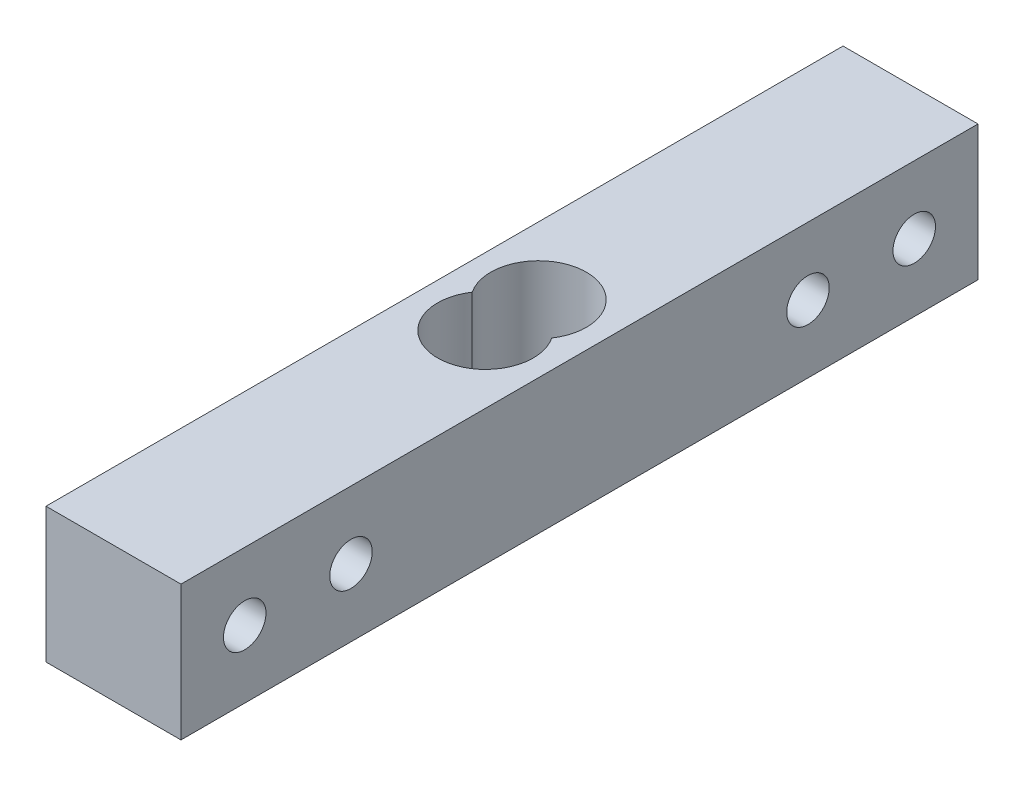
ISO-10303-21;
HEADER;
FILE_DESCRIPTION(('STEP AP214'),'2;1');
FILE_NAME('part.step','',(''),(''),'','','');
FILE_SCHEMA(('AUTOMOTIVE_DESIGN { 1 0 10303 214 1 1 1 1 }'));
ENDSEC;
DATA;
#1=APPLICATION_CONTEXT('core data for automotive mechanical design processes');
#2=APPLICATION_PROTOCOL_DEFINITION('international standard','automotive_design',2000,#1);
#3=PRODUCT_CONTEXT('',#1,'mechanical');
#4=PRODUCT('Part','Part','',(#3));
#5=PRODUCT_RELATED_PRODUCT_CATEGORY('part','',(#4));
#6=PRODUCT_DEFINITION_FORMATION('','',#4);
#7=PRODUCT_DEFINITION_CONTEXT('part definition',#1,'design');
#8=PRODUCT_DEFINITION('design','',#6,#7);
#9=PRODUCT_DEFINITION_SHAPE('','',#8);
#10=(LENGTH_UNIT() NAMED_UNIT(*) SI_UNIT(.MILLI.,.METRE.));
#11=(NAMED_UNIT(*) PLANE_ANGLE_UNIT() SI_UNIT($,.RADIAN.));
#12=(NAMED_UNIT(*) SI_UNIT($,.STERADIAN.) SOLID_ANGLE_UNIT());
#13=UNCERTAINTY_MEASURE_WITH_UNIT(LENGTH_MEASURE(1.E-05),#10,'distance_accuracy_value','');
#14=(GEOMETRIC_REPRESENTATION_CONTEXT(3) GLOBAL_UNCERTAINTY_ASSIGNED_CONTEXT((#13)) GLOBAL_UNIT_ASSIGNED_CONTEXT((#10,
#11,#12)) REPRESENTATION_CONTEXT('',''));
#15=CARTESIAN_POINT('',(0.,0.,0.));
#16=DIRECTION('',(0.,0.,1.));
#17=DIRECTION('',(1.,0.,0.));
#18=AXIS2_PLACEMENT_3D('',#15,#16,#17);
#19=CARTESIAN_POINT('',(6.35,-6.35,37.5));
#20=DIRECTION('',(-1.,0.,0.));
#21=DIRECTION('',(0.,0.,1.));
#22=AXIS2_PLACEMENT_3D('',#19,#20,#21);
#23=PLANE('',#22);
#24=CARTESIAN_POINT('',(6.35,0.,31.5));
#25=DIRECTION('',(1.,0.,0.));
#26=DIRECTION('',(0.,0.,-1.));
#27=AXIS2_PLACEMENT_3D('',#24,#25,#26);
#28=CIRCLE('',#27,2.);
#29=CARTESIAN_POINT('',(6.35,0.,29.5));
#30=VERTEX_POINT('',#29);
#31=EDGE_CURVE('E105',#30,#30,#28,.T.);
#32=ORIENTED_EDGE('',*,*,#31,.F.);
#33=EDGE_LOOP('',(#32));
#34=FACE_BOUND('',#33,.T.);
#35=CARTESIAN_POINT('',(6.35,0.,21.5));
#36=DIRECTION('',(1.,0.,0.));
#37=DIRECTION('',(0.,0.,-1.));
#38=AXIS2_PLACEMENT_3D('',#35,#36,#37);
#39=CIRCLE('',#38,2.);
#40=CARTESIAN_POINT('',(6.35,0.,19.5));
#41=VERTEX_POINT('',#40);
#42=EDGE_CURVE('E109',#41,#41,#39,.T.);
#43=ORIENTED_EDGE('',*,*,#42,.F.);
#44=EDGE_LOOP('',(#43));
#45=FACE_BOUND('',#44,.T.);
#46=CARTESIAN_POINT('',(6.35,0.,-21.5));
#47=DIRECTION('',(1.,0.,0.));
#48=DIRECTION('',(0.,0.,-1.));
#49=AXIS2_PLACEMENT_3D('',#46,#47,#48);
#50=CIRCLE('',#49,2.);
#51=CARTESIAN_POINT('',(6.35,0.,-23.5));
#52=VERTEX_POINT('',#51);
#53=EDGE_CURVE('E112',#52,#52,#50,.T.);
#54=ORIENTED_EDGE('',*,*,#53,.F.);
#55=EDGE_LOOP('',(#54));
#56=FACE_BOUND('',#55,.T.);
#57=CARTESIAN_POINT('',(6.35,0.,-31.5));
#58=DIRECTION('',(1.,0.,0.));
#59=DIRECTION('',(0.,0.,-1.));
#60=AXIS2_PLACEMENT_3D('',#57,#58,#59);
#61=CIRCLE('',#60,2.);
#62=CARTESIAN_POINT('',(6.35,0.,-33.5));
#63=VERTEX_POINT('',#62);
#64=EDGE_CURVE('E104',#63,#63,#61,.T.);
#65=ORIENTED_EDGE('',*,*,#64,.F.);
#66=EDGE_LOOP('',(#65));
#67=FACE_BOUND('',#66,.T.);
#68=DIRECTION('',(0.,1.,0.));
#69=VECTOR('',#68,1.);
#70=CARTESIAN_POINT('',(6.35,-6.35,-37.5));
#71=LINE('',#70,#69);
#72=CARTESIAN_POINT('',(6.35,-6.35,-37.5));
#73=VERTEX_POINT('',#72);
#74=CARTESIAN_POINT('',(6.35,6.35,-37.5));
#75=VERTEX_POINT('',#74);
#76=EDGE_CURVE('E128',#73,#75,#71,.T.);
#77=ORIENTED_EDGE('',*,*,#76,.T.);
#78=DIRECTION('',(0.,0.,-1.));
#79=VECTOR('',#78,1.);
#80=CARTESIAN_POINT('',(6.35,6.35,37.5));
#81=LINE('',#80,#79);
#82=CARTESIAN_POINT('',(6.35,6.35,37.5));
#83=VERTEX_POINT('',#82);
#84=EDGE_CURVE('E11',#83,#75,#81,.T.);
#85=ORIENTED_EDGE('',*,*,#84,.F.);
#86=DIRECTION('',(0.,1.,0.));
#87=VECTOR('',#86,1.);
#88=CARTESIAN_POINT('',(6.35,-6.35,37.5));
#89=LINE('',#88,#87);
#90=CARTESIAN_POINT('',(6.35,-6.35,37.5));
#91=VERTEX_POINT('',#90);
#92=EDGE_CURVE('E117',#91,#83,#89,.T.);
#93=ORIENTED_EDGE('',*,*,#92,.F.);
#94=DIRECTION('',(0.,0.,-1.));
#95=VECTOR('',#94,1.);
#96=CARTESIAN_POINT('',(6.35,-6.35,37.5));
#97=LINE('',#96,#95);
#98=EDGE_CURVE('E127',#91,#73,#97,.T.);
#99=ORIENTED_EDGE('',*,*,#98,.T.);
#100=EDGE_LOOP('',(#77,#85,#93,#99));
#101=FACE_BOUND('',#100,.T.);
#102=ADVANCED_FACE('F33',(#34,#45,#56,#67,#101),#23,.F.);
#103=CARTESIAN_POINT('',(-6.35,6.35,37.5));
#104=DIRECTION('',(0.,-1.,0.));
#105=DIRECTION('',(0.,0.,-1.));
#106=AXIS2_PLACEMENT_3D('',#103,#104,#105);
#107=PLANE('',#106);
#108=CARTESIAN_POINT('',(0.,6.34999999999999,2.5));
#109=DIRECTION('',(0.,-1.,0.));
#110=DIRECTION('',(0.,0.,-1.));
#111=AXIS2_PLACEMENT_3D('',#108,#109,#110);
#112=CIRCLE('',#111,4.5);
#113=CARTESIAN_POINT('',(3.74165738677394,6.34999999999999,0.));
#114=VERTEX_POINT('',#113);
#115=CARTESIAN_POINT('',(-3.74165738677394,6.34999999999999,0.));
#116=VERTEX_POINT('',#115);
#117=EDGE_CURVE('E89',#114,#116,#112,.T.);
#118=ORIENTED_EDGE('',*,*,#117,.T.);
#119=CARTESIAN_POINT('',(0.,6.34999999999999,-2.5));
#120=DIRECTION('',(0.,-1.,0.));
#121=DIRECTION('',(0.,0.,-1.));
#122=AXIS2_PLACEMENT_3D('',#119,#120,#121);
#123=CIRCLE('',#122,4.5);
#124=EDGE_CURVE('E87',#116,#114,#123,.T.);
#125=ORIENTED_EDGE('',*,*,#124,.T.);
#126=EDGE_LOOP('',(#118,#125));
#127=FACE_BOUND('',#126,.T.);
#128=DIRECTION('',(-1.,0.,0.));
#129=VECTOR('',#128,1.);
#130=CARTESIAN_POINT('',(-6.35,6.35,-37.5));
#131=LINE('',#130,#129);
#132=CARTESIAN_POINT('',(-6.35,6.35,-37.5));
#133=VERTEX_POINT('',#132);
#134=EDGE_CURVE('E131',#75,#133,#131,.T.);
#135=ORIENTED_EDGE('',*,*,#134,.T.);
#136=DIRECTION('',(0.,0.,-1.));
#137=VECTOR('',#136,1.);
#138=CARTESIAN_POINT('',(-6.35,6.35,37.5));
#139=LINE('',#138,#137);
#140=CARTESIAN_POINT('',(-6.35,6.35,37.5));
#141=VERTEX_POINT('',#140);
#142=EDGE_CURVE('E41',#141,#133,#139,.T.);
#143=ORIENTED_EDGE('',*,*,#142,.F.);
#144=DIRECTION('',(-1.,0.,0.));
#145=VECTOR('',#144,1.);
#146=CARTESIAN_POINT('',(-6.35,6.35,37.5));
#147=LINE('',#146,#145);
#148=EDGE_CURVE('E120',#83,#141,#147,.T.);
#149=ORIENTED_EDGE('',*,*,#148,.F.);
#150=ORIENTED_EDGE('',*,*,#84,.T.);
#151=EDGE_LOOP('',(#135,#143,#149,#150));
#152=FACE_BOUND('',#151,.T.);
#153=ADVANCED_FACE('F170',(#127,#152),#107,.F.);
#154=CARTESIAN_POINT('',(-6.35,-6.35,37.5));
#155=DIRECTION('',(1.,0.,0.));
#156=DIRECTION('',(0.,0.,-1.));
#157=AXIS2_PLACEMENT_3D('',#154,#155,#156);
#158=PLANE('',#157);
#159=CARTESIAN_POINT('',(-6.34999999999999,0.,31.5));
#160=DIRECTION('',(1.,0.,0.));
#161=DIRECTION('',(0.,0.,-1.));
#162=AXIS2_PLACEMENT_3D('',#159,#160,#161);
#163=CIRCLE('',#162,2.);
#164=CARTESIAN_POINT('',(-6.34999999999999,0.,29.5));
#165=VERTEX_POINT('',#164);
#166=EDGE_CURVE('E36',#165,#165,#163,.T.);
#167=ORIENTED_EDGE('',*,*,#166,.T.);
#168=EDGE_LOOP('',(#167));
#169=FACE_BOUND('',#168,.T.);
#170=CARTESIAN_POINT('',(-6.34999999999999,0.,21.5));
#171=DIRECTION('',(1.,0.,0.));
#172=DIRECTION('',(0.,0.,-1.));
#173=AXIS2_PLACEMENT_3D('',#170,#171,#172);
#174=CIRCLE('',#173,2.);
#175=CARTESIAN_POINT('',(-6.34999999999999,0.,19.5));
#176=VERTEX_POINT('',#175);
#177=EDGE_CURVE('E147',#176,#176,#174,.T.);
#178=ORIENTED_EDGE('',*,*,#177,.T.);
#179=EDGE_LOOP('',(#178));
#180=FACE_BOUND('',#179,.T.);
#181=CARTESIAN_POINT('',(-6.34999999999999,0.,-21.5));
#182=DIRECTION('',(1.,0.,0.));
#183=DIRECTION('',(0.,0.,-1.));
#184=AXIS2_PLACEMENT_3D('',#181,#182,#183);
#185=CIRCLE('',#184,2.);
#186=CARTESIAN_POINT('',(-6.34999999999999,0.,-23.5));
#187=VERTEX_POINT('',#186);
#188=EDGE_CURVE('E145',#187,#187,#185,.T.);
#189=ORIENTED_EDGE('',*,*,#188,.T.);
#190=EDGE_LOOP('',(#189));
#191=FACE_BOUND('',#190,.T.);
#192=CARTESIAN_POINT('',(-6.34999999999999,0.,-31.5));
#193=DIRECTION('',(1.,0.,0.));
#194=DIRECTION('',(0.,0.,-1.));
#195=AXIS2_PLACEMENT_3D('',#192,#193,#194);
#196=CIRCLE('',#195,2.);
#197=CARTESIAN_POINT('',(-6.34999999999999,0.,-33.5));
#198=VERTEX_POINT('',#197);
#199=EDGE_CURVE('E108',#198,#198,#196,.T.);
#200=ORIENTED_EDGE('',*,*,#199,.T.);
#201=EDGE_LOOP('',(#200));
#202=FACE_BOUND('',#201,.T.);
#203=DIRECTION('',(0.,-1.,0.));
#204=VECTOR('',#203,1.);
#205=CARTESIAN_POINT('',(-6.35,-6.35,-37.5));
#206=LINE('',#205,#204);
#207=CARTESIAN_POINT('',(-6.35,-6.35,-37.5));
#208=VERTEX_POINT('',#207);
#209=EDGE_CURVE('E133',#133,#208,#206,.T.);
#210=ORIENTED_EDGE('',*,*,#209,.T.);
#211=DIRECTION('',(0.,0.,-1.));
#212=VECTOR('',#211,1.);
#213=CARTESIAN_POINT('',(-6.35,-6.35,37.5));
#214=LINE('',#213,#212);
#215=CARTESIAN_POINT('',(-6.35,-6.35,37.5));
#216=VERTEX_POINT('',#215);
#217=EDGE_CURVE('E138',#216,#208,#214,.T.);
#218=ORIENTED_EDGE('',*,*,#217,.F.);
#219=DIRECTION('',(0.,-1.,0.));
#220=VECTOR('',#219,1.);
#221=CARTESIAN_POINT('',(-6.35,-6.35,37.5));
#222=LINE('',#221,#220);
#223=EDGE_CURVE('E123',#141,#216,#222,.T.);
#224=ORIENTED_EDGE('',*,*,#223,.F.);
#225=ORIENTED_EDGE('',*,*,#142,.T.);
#226=EDGE_LOOP('',(#210,#218,#224,#225));
#227=FACE_BOUND('',#226,.T.);
#228=ADVANCED_FACE('F154',(#169,#180,#191,#202,#227),#158,.F.);
#229=CARTESIAN_POINT('',(-6.35,-6.35,37.5));
#230=DIRECTION('',(0.,1.,0.));
#231=DIRECTION('',(0.,0.,1.));
#232=AXIS2_PLACEMENT_3D('',#229,#230,#231);
#233=PLANE('',#232);
#234=CARTESIAN_POINT('',(0.,-6.35,2.5));
#235=DIRECTION('',(0.,-1.,0.));
#236=DIRECTION('',(0.,0.,-1.));
#237=AXIS2_PLACEMENT_3D('',#234,#235,#236);
#238=CIRCLE('',#237,4.5);
#239=CARTESIAN_POINT('',(3.74165738677394,-6.34999999999999,0.));
#240=VERTEX_POINT('',#239);
#241=CARTESIAN_POINT('',(-3.74165738677394,-6.35,0.));
#242=VERTEX_POINT('',#241);
#243=EDGE_CURVE('E93',#240,#242,#238,.T.);
#244=ORIENTED_EDGE('',*,*,#243,.F.);
#245=CARTESIAN_POINT('',(0.,-6.35,-2.5));
#246=DIRECTION('',(0.,-1.,0.));
#247=DIRECTION('',(0.,0.,-1.));
#248=AXIS2_PLACEMENT_3D('',#245,#246,#247);
#249=CIRCLE('',#248,4.5);
#250=EDGE_CURVE('E56',#242,#240,#249,.T.);
#251=ORIENTED_EDGE('',*,*,#250,.F.);
#252=EDGE_LOOP('',(#244,#251));
#253=FACE_BOUND('',#252,.T.);
#254=DIRECTION('',(1.,0.,0.));
#255=VECTOR('',#254,1.);
#256=CARTESIAN_POINT('',(-6.35,-6.35,-37.5));
#257=LINE('',#256,#255);
#258=EDGE_CURVE('E121',#208,#73,#257,.T.);
#259=ORIENTED_EDGE('',*,*,#258,.T.);
#260=ORIENTED_EDGE('',*,*,#98,.F.);
#261=DIRECTION('',(1.,0.,0.));
#262=VECTOR('',#261,1.);
#263=CARTESIAN_POINT('',(-6.35,-6.35,37.5));
#264=LINE('',#263,#262);
#265=EDGE_CURVE('E125',#216,#91,#264,.T.);
#266=ORIENTED_EDGE('',*,*,#265,.F.);
#267=ORIENTED_EDGE('',*,*,#217,.T.);
#268=EDGE_LOOP('',(#259,#260,#266,#267));
#269=FACE_BOUND('',#268,.T.);
#270=ADVANCED_FACE('F97',(#253,#269),#233,.F.);
#271=CARTESIAN_POINT('',(0.,0.,37.5));
#272=DIRECTION('',(0.,0.,-1.));
#273=DIRECTION('',(-1.,0.,0.));
#274=AXIS2_PLACEMENT_3D('',#271,#272,#273);
#275=PLANE('',#274);
#276=ORIENTED_EDGE('',*,*,#92,.T.);
#277=ORIENTED_EDGE('',*,*,#148,.T.);
#278=ORIENTED_EDGE('',*,*,#223,.T.);
#279=ORIENTED_EDGE('',*,*,#265,.T.);
#280=EDGE_LOOP('',(#276,#277,#278,#279));
#281=FACE_BOUND('',#280,.T.);
#282=ADVANCED_FACE('F196',(#281),#275,.F.);
#283=CARTESIAN_POINT('',(0.,0.,-37.5));
#284=DIRECTION('',(0.,0.,-1.));
#285=DIRECTION('',(-1.,0.,0.));
#286=AXIS2_PLACEMENT_3D('',#283,#284,#285);
#287=PLANE('',#286);
#288=ORIENTED_EDGE('',*,*,#76,.F.);
#289=ORIENTED_EDGE('',*,*,#258,.F.);
#290=ORIENTED_EDGE('',*,*,#209,.F.);
#291=ORIENTED_EDGE('',*,*,#134,.F.);
#292=EDGE_LOOP('',(#288,#289,#290,#291));
#293=FACE_BOUND('',#292,.T.);
#294=ADVANCED_FACE('F190',(#293),#287,.T.);
#295=CARTESIAN_POINT('',(-73.65,0.,-31.5));
#296=DIRECTION('',(1.,0.,0.));
#297=DIRECTION('',(0.,0.,-1.));
#298=AXIS2_PLACEMENT_3D('',#295,#296,#297);
#299=CYLINDRICAL_SURFACE('',#298,2.);
#300=ORIENTED_EDGE('',*,*,#64,.T.);
#301=EDGE_LOOP('',(#300));
#302=FACE_BOUND('',#301,.T.);
#303=ORIENTED_EDGE('',*,*,#199,.F.);
#304=EDGE_LOOP('',(#303));
#305=FACE_BOUND('',#304,.T.);
#306=ADVANCED_FACE('F209',(#302,#305),#299,.F.);
#307=CARTESIAN_POINT('',(-73.65,0.,-21.5));
#308=DIRECTION('',(1.,0.,0.));
#309=DIRECTION('',(0.,0.,-1.));
#310=AXIS2_PLACEMENT_3D('',#307,#308,#309);
#311=CYLINDRICAL_SURFACE('',#310,2.);
#312=ORIENTED_EDGE('',*,*,#53,.T.);
#313=EDGE_LOOP('',(#312));
#314=FACE_BOUND('',#313,.T.);
#315=ORIENTED_EDGE('',*,*,#188,.F.);
#316=EDGE_LOOP('',(#315));
#317=FACE_BOUND('',#316,.T.);
#318=ADVANCED_FACE('F166',(#314,#317),#311,.F.);
#319=CARTESIAN_POINT('',(-73.65,0.,21.5));
#320=DIRECTION('',(1.,0.,0.));
#321=DIRECTION('',(0.,0.,-1.));
#322=AXIS2_PLACEMENT_3D('',#319,#320,#321);
#323=CYLINDRICAL_SURFACE('',#322,2.);
#324=ORIENTED_EDGE('',*,*,#42,.T.);
#325=EDGE_LOOP('',(#324));
#326=FACE_BOUND('',#325,.T.);
#327=ORIENTED_EDGE('',*,*,#177,.F.);
#328=EDGE_LOOP('',(#327));
#329=FACE_BOUND('',#328,.T.);
#330=ADVANCED_FACE('F158',(#326,#329),#323,.F.);
#331=CARTESIAN_POINT('',(-73.65,0.,31.5));
#332=DIRECTION('',(1.,0.,0.));
#333=DIRECTION('',(0.,0.,-1.));
#334=AXIS2_PLACEMENT_3D('',#331,#332,#333);
#335=CYLINDRICAL_SURFACE('',#334,2.);
#336=ORIENTED_EDGE('',*,*,#31,.T.);
#337=EDGE_LOOP('',(#336));
#338=FACE_BOUND('',#337,.T.);
#339=ORIENTED_EDGE('',*,*,#166,.F.);
#340=EDGE_LOOP('',(#339));
#341=FACE_BOUND('',#340,.T.);
#342=ADVANCED_FACE('F156',(#338,#341),#335,.F.);
#343=CARTESIAN_POINT('',(0.,73.65,-2.5));
#344=DIRECTION('',(0.,-1.,0.));
#345=DIRECTION('',(0.,0.,-1.));
#346=AXIS2_PLACEMENT_3D('',#343,#344,#345);
#347=CYLINDRICAL_SURFACE('',#346,4.5);
#348=DIRECTION('',(0.,-1.,0.));
#349=VECTOR('',#348,1.);
#350=CARTESIAN_POINT('',(-3.74165738677394,73.65,0.));
#351=LINE('',#350,#349);
#352=EDGE_CURVE('E49',#116,#242,#351,.T.);
#353=ORIENTED_EDGE('',*,*,#352,.T.);
#354=ORIENTED_EDGE('',*,*,#250,.T.);
#355=DIRECTION('',(0.,-1.,0.));
#356=VECTOR('',#355,1.);
#357=CARTESIAN_POINT('',(3.74165738677394,73.65,0.));
#358=LINE('',#357,#356);
#359=EDGE_CURVE('E90',#114,#240,#358,.T.);
#360=ORIENTED_EDGE('',*,*,#359,.F.);
#361=ORIENTED_EDGE('',*,*,#124,.F.);
#362=EDGE_LOOP('',(#353,#354,#360,#361));
#363=FACE_BOUND('',#362,.T.);
#364=ADVANCED_FACE('F85',(#363),#347,.F.);
#365=CARTESIAN_POINT('',(0.,73.65,2.5));
#366=DIRECTION('',(0.,-1.,0.));
#367=DIRECTION('',(0.,0.,-1.));
#368=AXIS2_PLACEMENT_3D('',#365,#366,#367);
#369=CYLINDRICAL_SURFACE('',#368,4.5);
#370=ORIENTED_EDGE('',*,*,#359,.T.);
#371=ORIENTED_EDGE('',*,*,#243,.T.);
#372=ORIENTED_EDGE('',*,*,#352,.F.);
#373=ORIENTED_EDGE('',*,*,#117,.F.);
#374=EDGE_LOOP('',(#370,#371,#372,#373));
#375=FACE_BOUND('',#374,.T.);
#376=ADVANCED_FACE('F94',(#375),#369,.F.);
#377=CLOSED_SHELL('',(#102,#153,#228,#270,#282,#294,#306,#318,#330,#342,#364,#376));
#378=MANIFOLD_SOLID_BREP('B2',#377);
#379=ADVANCED_BREP_SHAPE_REPRESENTATION('',(#18,#378),#14);
#380=SHAPE_DEFINITION_REPRESENTATION(#9,#379);
ENDSEC;
END-ISO-10303-21;
